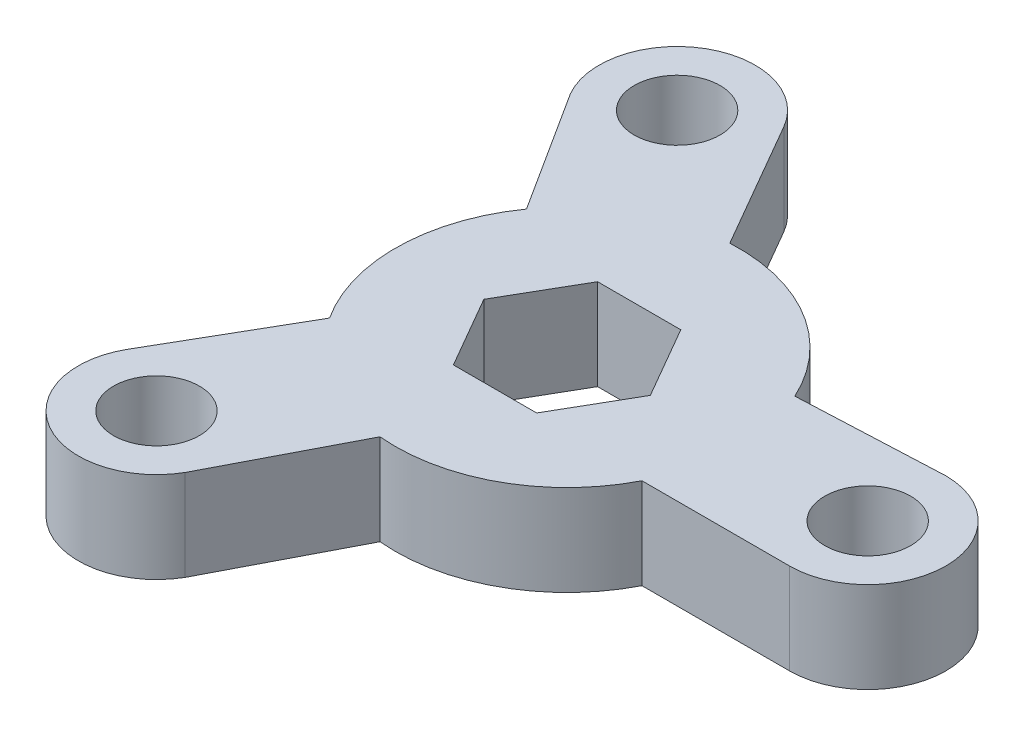
ISO-10303-21;
HEADER;
FILE_DESCRIPTION(('STEP AP214'),'2;1');
FILE_NAME('part.step','',(''),(''),'','','');
FILE_SCHEMA(('AUTOMOTIVE_DESIGN { 1 0 10303 214 1 1 1 1 }'));
ENDSEC;
DATA;
#1=APPLICATION_CONTEXT('core data for automotive mechanical design processes');
#2=APPLICATION_PROTOCOL_DEFINITION('international standard','automotive_design',2000,#1);
#3=PRODUCT_CONTEXT('',#1,'mechanical');
#4=PRODUCT('Part','Part','',(#3));
#5=PRODUCT_RELATED_PRODUCT_CATEGORY('part','',(#4));
#6=PRODUCT_DEFINITION_FORMATION('','',#4);
#7=PRODUCT_DEFINITION_CONTEXT('part definition',#1,'design');
#8=PRODUCT_DEFINITION('design','',#6,#7);
#9=PRODUCT_DEFINITION_SHAPE('','',#8);
#10=(LENGTH_UNIT() NAMED_UNIT(*) SI_UNIT(.MILLI.,.METRE.));
#11=(NAMED_UNIT(*) PLANE_ANGLE_UNIT() SI_UNIT($,.RADIAN.));
#12=(NAMED_UNIT(*) SI_UNIT($,.STERADIAN.) SOLID_ANGLE_UNIT());
#13=UNCERTAINTY_MEASURE_WITH_UNIT(LENGTH_MEASURE(1.E-05),#10,'distance_accuracy_value','');
#14=(GEOMETRIC_REPRESENTATION_CONTEXT(3) GLOBAL_UNCERTAINTY_ASSIGNED_CONTEXT((#13)) GLOBAL_UNIT_ASSIGNED_CONTEXT((#10,
#11,#12)) REPRESENTATION_CONTEXT('',''));
#15=CARTESIAN_POINT('',(0.,0.,0.));
#16=DIRECTION('',(0.,0.,1.));
#17=DIRECTION('',(1.,0.,0.));
#18=AXIS2_PLACEMENT_3D('',#15,#16,#17);
#19=CARTESIAN_POINT('',(0.000141202007934749,3.175,-9.02915575815009E-05));
#20=DIRECTION('',(0.842481897664744,0.,-0.538724653331562));
#21=DIRECTION('',(-0.538724653331562,0.,-0.842481897664744));
#22=AXIS2_PLACEMENT_3D('',#19,#20,#21);
#23=PLANE('',#22);
#24=DIRECTION('',(0.538724653331562,0.,0.842481897664744));
#25=VECTOR('',#24,1.);
#26=CARTESIAN_POINT('',(0.000141202007934749,0.,-9.02915575815009E-05));
#27=LINE('',#26,#25);
#28=CARTESIAN_POINT('',(-5.09848661235615,0.,-7.973554305071));
#29=VERTEX_POINT('',#28);
#30=CARTESIAN_POINT('',(-2.37747949642457,0.,-3.71832071883577));
#31=VERTEX_POINT('',#30);
#32=EDGE_CURVE('E195',#29,#31,#27,.T.);
#33=ORIENTED_EDGE('',*,*,#32,.T.);
#34=DIRECTION('',(0.,-1.,0.));
#35=VECTOR('',#34,1.);
#36=CARTESIAN_POINT('',(-2.37747949642457,3.175,-3.71832071883577));
#37=LINE('',#36,#35);
#38=CARTESIAN_POINT('',(-2.37747949642457,3.175,-3.71832071883577));
#39=VERTEX_POINT('',#38);
#40=EDGE_CURVE('E305',#39,#31,#37,.T.);
#41=ORIENTED_EDGE('',*,*,#40,.F.);
#42=DIRECTION('',(0.538724653331562,0.,0.842481897664744));
#43=VECTOR('',#42,1.);
#44=CARTESIAN_POINT('',(0.000141202007934749,3.175,-9.02915575815009E-05));
#45=LINE('',#44,#43);
#46=CARTESIAN_POINT('',(-5.09848661235615,3.175,-7.973554305071));
#47=VERTEX_POINT('',#46);
#48=EDGE_CURVE('E202',#47,#39,#45,.T.);
#49=ORIENTED_EDGE('',*,*,#48,.F.);
#50=DIRECTION('',(0.,-1.,0.));
#51=VECTOR('',#50,1.);
#52=CARTESIAN_POINT('',(-5.09848661235615,3.175,-7.973554305071));
#53=LINE('',#52,#51);
#54=EDGE_CURVE('E240',#47,#29,#53,.T.);
#55=ORIENTED_EDGE('',*,*,#54,.T.);
#56=EDGE_LOOP('',(#33,#41,#49,#55));
#57=FACE_BOUND('',#56,.T.);
#58=ADVANCED_FACE('F38',(#57),#23,.F.);
#59=CARTESIAN_POINT('',(2.51476204169552,3.175,-0.24470981191342));
#60=DIRECTION('',(0.,-1.,0.));
#61=DIRECTION('',(0.,0.,-1.));
#62=AXIS2_PLACEMENT_3D('',#59,#60,#61);
#63=CYLINDRICAL_SURFACE('',#62,6.00000000000002);
#64=CARTESIAN_POINT('',(2.51476204169552,0.,-0.24470981191342));
#65=DIRECTION('',(0.,1.,0.));
#66=DIRECTION('',(0.,0.,1.));
#67=AXIS2_PLACEMENT_3D('',#64,#65,#66);
#68=CIRCLE('',#67,6.00000000000002);
#69=CARTESIAN_POINT('',(-2.52025605095693,0.,3.01850835527385));
#70=VERTEX_POINT('',#69);
#71=EDGE_CURVE('E243',#31,#70,#68,.T.);
#72=ORIENTED_EDGE('',*,*,#71,.T.);
#73=DIRECTION('',(0.,-1.,0.));
#74=VECTOR('',#73,1.);
#75=CARTESIAN_POINT('',(-2.52025605095693,3.175,3.01850835527385));
#76=LINE('',#75,#74);
#77=CARTESIAN_POINT('',(-2.52025605095693,3.175,3.01850835527385));
#78=VERTEX_POINT('',#77);
#79=EDGE_CURVE('E303',#78,#70,#76,.T.);
#80=ORIENTED_EDGE('',*,*,#79,.F.);
#81=CARTESIAN_POINT('',(2.51476204169552,3.175,-0.24470981191342));
#82=DIRECTION('',(0.,1.,0.));
#83=DIRECTION('',(0.,0.,1.));
#84=AXIS2_PLACEMENT_3D('',#81,#82,#83);
#85=CIRCLE('',#84,6.00000000000002);
#86=EDGE_CURVE('E205',#39,#78,#85,.T.);
#87=ORIENTED_EDGE('',*,*,#86,.F.);
#88=ORIENTED_EDGE('',*,*,#40,.T.);
#89=EDGE_LOOP('',(#72,#80,#87,#88));
#90=FACE_BOUND('',#89,.T.);
#91=ADVANCED_FACE('F343',(#90),#63,.T.);
#92=CARTESIAN_POINT('',(-0.583139579616312,3.175,-0.336675793266596));
#93=DIRECTION('',(-0.866025403784443,0.,-0.499999999999992));
#94=DIRECTION('',(-0.499999999999992,0.,0.866025403784443));
#95=AXIS2_PLACEMENT_3D('',#92,#93,#94);
#96=PLANE('',#95);
#97=DIRECTION('',(0.499999999999992,0.,-0.866025403784443));
#98=VECTOR('',#97,1.);
#99=CARTESIAN_POINT('',(-0.583139579616312,0.,-0.336675793266596));
#100=LINE('',#99,#98);
#101=CARTESIAN_POINT('',(-5.09848661235621,0.,7.48413468124445));
#102=VERTEX_POINT('',#101);
#103=EDGE_CURVE('E246',#102,#70,#100,.T.);
#104=ORIENTED_EDGE('',*,*,#103,.F.);
#105=DIRECTION('',(0.,-1.,0.));
#106=VECTOR('',#105,1.);
#107=CARTESIAN_POINT('',(-5.09848661235621,3.175,7.48413468124445));
#108=LINE('',#107,#106);
#109=CARTESIAN_POINT('',(-5.09848661235621,3.175,7.48413468124445));
#110=VERTEX_POINT('',#109);
#111=EDGE_CURVE('E301',#110,#102,#108,.T.);
#112=ORIENTED_EDGE('',*,*,#111,.F.);
#113=DIRECTION('',(0.499999999999992,0.,-0.866025403784443));
#114=VECTOR('',#113,1.);
#115=CARTESIAN_POINT('',(-0.583139579616312,3.175,-0.336675793266596));
#116=LINE('',#115,#114);
#117=EDGE_CURVE('E208',#110,#78,#116,.T.);
#118=ORIENTED_EDGE('',*,*,#117,.T.);
#119=ORIENTED_EDGE('',*,*,#79,.T.);
#120=EDGE_LOOP('',(#104,#112,#118,#119));
#121=FACE_BOUND('',#120,.T.);
#122=ADVANCED_FACE('F348',(#121),#96,.T.);
#123=CARTESIAN_POINT('',(-2.73523795830433,3.175,8.84855692782332));
#124=DIRECTION('',(0.,-1.,0.));
#125=DIRECTION('',(0.,0.,-1.));
#126=AXIS2_PLACEMENT_3D('',#123,#124,#125);
#127=CYLINDRICAL_SURFACE('',#126,2.72884449315768);
#128=CARTESIAN_POINT('',(-2.73523795830433,0.,8.84855692782332));
#129=DIRECTION('',(0.,1.,0.));
#130=DIRECTION('',(0.,0.,1.));
#131=AXIS2_PLACEMENT_3D('',#128,#129,#130);
#132=CIRCLE('',#131,2.72884449315768);
#133=CARTESIAN_POINT('',(-0.371989304252619,0.,10.2129791744022));
#134=VERTEX_POINT('',#133);
#135=EDGE_CURVE('E249',#102,#134,#132,.T.);
#136=ORIENTED_EDGE('',*,*,#135,.T.);
#137=DIRECTION('',(0.,-1.,0.));
#138=VECTOR('',#137,1.);
#139=CARTESIAN_POINT('',(-0.371989304252619,3.175,10.2129791744022));
#140=LINE('',#139,#138);
#141=CARTESIAN_POINT('',(-0.371989304252619,3.175,10.2129791744022));
#142=VERTEX_POINT('',#141);
#143=EDGE_CURVE('E298',#142,#134,#140,.T.);
#144=ORIENTED_EDGE('',*,*,#143,.F.);
#145=CARTESIAN_POINT('',(-2.73523795830433,3.175,8.84855692782332));
#146=DIRECTION('',(0.,1.,0.));
#147=DIRECTION('',(0.,0.,1.));
#148=AXIS2_PLACEMENT_3D('',#145,#146,#147);
#149=CIRCLE('',#148,2.72884449315768);
#150=EDGE_CURVE('E211',#110,#142,#149,.T.);
#151=ORIENTED_EDGE('',*,*,#150,.F.);
#152=ORIENTED_EDGE('',*,*,#111,.T.);
#153=EDGE_LOOP('',(#136,#144,#151,#152));
#154=FACE_BOUND('',#153,.T.);
#155=ADVANCED_FACE('F400',(#154),#127,.T.);
#156=CARTESIAN_POINT('',(3.87987291900624,3.175,2.01140464348378));
#157=DIRECTION('',(-0.887790184262472,0.,-0.460248398940405));
#158=DIRECTION('',(-0.460248398940405,0.,0.887790184262472));
#159=AXIS2_PLACEMENT_3D('',#156,#157,#158);
#160=PLANE('',#159);
#161=DIRECTION('',(0.460248398940405,0.,-0.887790184262472));
#162=VECTOR('',#161,1.);
#163=CARTESIAN_POINT('',(3.87987291900624,0.,2.01140464348378));
#164=LINE('',#163,#162);
#165=CARTESIAN_POINT('',(1.95264752249807,0.,5.72890109500941));
#166=VERTEX_POINT('',#165);
#167=EDGE_CURVE('E251',#134,#166,#164,.T.);
#168=ORIENTED_EDGE('',*,*,#167,.T.);
#169=DIRECTION('',(0.,-1.,0.));
#170=VECTOR('',#169,1.);
#171=CARTESIAN_POINT('',(1.95264752249807,3.175,5.72890109500941));
#172=LINE('',#171,#170);
#173=CARTESIAN_POINT('',(1.95264752249807,3.175,5.72890109500941));
#174=VERTEX_POINT('',#173);
#175=EDGE_CURVE('E295',#174,#166,#172,.T.);
#176=ORIENTED_EDGE('',*,*,#175,.F.);
#177=DIRECTION('',(0.460248398940405,0.,-0.887790184262472));
#178=VECTOR('',#177,1.);
#179=CARTESIAN_POINT('',(3.87987291900624,3.175,2.01140464348378));
#180=LINE('',#179,#178);
#181=EDGE_CURVE('E213',#142,#174,#180,.T.);
#182=ORIENTED_EDGE('',*,*,#181,.F.);
#183=ORIENTED_EDGE('',*,*,#143,.T.);
#184=EDGE_LOOP('',(#168,#176,#182,#183));
#185=FACE_BOUND('',#184,.T.);
#186=ADVANCED_FACE('F395',(#185),#160,.F.);
#187=CARTESIAN_POINT('',(2.51476204169552,3.175,-0.24470981191342));
#188=DIRECTION('',(0.,-1.,0.));
#189=DIRECTION('',(0.,0.,-1.));
#190=AXIS2_PLACEMENT_3D('',#187,#188,#189);
#191=CYLINDRICAL_SURFACE('',#190,6.00000000000002);
#192=CARTESIAN_POINT('',(2.51476204169552,0.,-0.24470981191342));
#193=DIRECTION('',(0.,1.,0.));
#194=DIRECTION('',(0.,0.,1.));
#195=AXIS2_PLACEMENT_3D('',#192,#193,#194);
#196=CIRCLE('',#195,6.00000000000002);
#197=CARTESIAN_POINT('',(7.85830091889671,0.,2.48413468124468));
#198=VERTEX_POINT('',#197);
#199=EDGE_CURVE('E253',#166,#198,#196,.T.);
#200=ORIENTED_EDGE('',*,*,#199,.T.);
#201=DIRECTION('',(0.,-1.,0.));
#202=VECTOR('',#201,1.);
#203=CARTESIAN_POINT('',(7.85830091889671,3.175,2.48413468124468));
#204=LINE('',#203,#202);
#205=CARTESIAN_POINT('',(7.85830091889671,3.175,2.48413468124468));
#206=VERTEX_POINT('',#205);
#207=EDGE_CURVE('E293',#206,#198,#204,.T.);
#208=ORIENTED_EDGE('',*,*,#207,.F.);
#209=CARTESIAN_POINT('',(2.51476204169552,3.175,-0.24470981191342));
#210=DIRECTION('',(0.,1.,0.));
#211=DIRECTION('',(0.,0.,1.));
#212=AXIS2_PLACEMENT_3D('',#209,#210,#211);
#213=CIRCLE('',#212,6.00000000000002);
#214=EDGE_CURVE('E215',#174,#206,#213,.T.);
#215=ORIENTED_EDGE('',*,*,#214,.F.);
#216=ORIENTED_EDGE('',*,*,#175,.T.);
#217=EDGE_LOOP('',(#200,#208,#215,#216));
#218=FACE_BOUND('',#217,.T.);
#219=ADVANCED_FACE('F391',(#218),#191,.T.);
#220=CARTESIAN_POINT('',(0.,3.175,2.48413468124466));
#221=DIRECTION('',(0.,0.,1.));
#222=DIRECTION('',(1.,0.,0.));
#223=AXIS2_PLACEMENT_3D('',#220,#221,#222);
#224=PLANE('',#223);
#225=DIRECTION('',(-1.,0.,0.));
#226=VECTOR('',#225,1.);
#227=CARTESIAN_POINT('',(0.,0.,2.48413468124466));
#228=LINE('',#227,#226);
#229=CARTESIAN_POINT('',(13.0147620416956,0.,2.48413468124467));
#230=VERTEX_POINT('',#229);
#231=EDGE_CURVE('E256',#230,#198,#228,.T.);
#232=ORIENTED_EDGE('',*,*,#231,.F.);
#233=DIRECTION('',(0.,-1.,0.));
#234=VECTOR('',#233,1.);
#235=CARTESIAN_POINT('',(13.0147620416956,3.175,2.48413468124467));
#236=LINE('',#235,#234);
#237=CARTESIAN_POINT('',(13.0147620416956,3.175,2.48413468124467));
#238=VERTEX_POINT('',#237);
#239=EDGE_CURVE('E291',#238,#230,#236,.T.);
#240=ORIENTED_EDGE('',*,*,#239,.F.);
#241=DIRECTION('',(-1.,0.,0.));
#242=VECTOR('',#241,1.);
#243=CARTESIAN_POINT('',(0.,3.175,2.48413468124466));
#244=LINE('',#243,#242);
#245=EDGE_CURVE('E217',#238,#206,#244,.T.);
#246=ORIENTED_EDGE('',*,*,#245,.T.);
#247=ORIENTED_EDGE('',*,*,#207,.T.);
#248=EDGE_LOOP('',(#232,#240,#246,#247));
#249=FACE_BOUND('',#248,.T.);
#250=ADVANCED_FACE('F387',(#249),#224,.T.);
#251=CARTESIAN_POINT('',(13.0147620416956,3.175,-0.244709811913082));
#252=DIRECTION('',(0.,-1.,0.));
#253=DIRECTION('',(0.,0.,-1.));
#254=AXIS2_PLACEMENT_3D('',#251,#252,#253);
#255=CYLINDRICAL_SURFACE('',#254,2.72884449315774);
#256=CARTESIAN_POINT('',(13.0147620416956,0.,-0.244709811913082));
#257=DIRECTION('',(0.,1.,0.));
#258=DIRECTION('',(0.,0.,1.));
#259=AXIS2_PLACEMENT_3D('',#256,#257,#258);
#260=CIRCLE('',#259,2.72884449315774);
#261=CARTESIAN_POINT('',(13.0147620416957,0.,-2.97355430507082));
#262=VERTEX_POINT('',#261);
#263=EDGE_CURVE('E259',#230,#262,#260,.T.);
#264=ORIENTED_EDGE('',*,*,#263,.T.);
#265=DIRECTION('',(0.,-1.,0.));
#266=VECTOR('',#265,1.);
#267=CARTESIAN_POINT('',(13.0147620416957,3.175,-2.97355430507082));
#268=LINE('',#267,#266);
#269=CARTESIAN_POINT('',(13.0147620416957,3.175,-2.97355430507082));
#270=VERTEX_POINT('',#269);
#271=EDGE_CURVE('E288',#270,#262,#268,.T.);
#272=ORIENTED_EDGE('',*,*,#271,.F.);
#273=CARTESIAN_POINT('',(13.0147620416956,3.175,-0.244709811913082));
#274=DIRECTION('',(0.,1.,0.));
#275=DIRECTION('',(0.,0.,1.));
#276=AXIS2_PLACEMENT_3D('',#273,#274,#275);
#277=CIRCLE('',#276,2.72884449315774);
#278=EDGE_CURVE('E220',#238,#270,#277,.T.);
#279=ORIENTED_EDGE('',*,*,#278,.F.);
#280=ORIENTED_EDGE('',*,*,#239,.T.);
#281=EDGE_LOOP('',(#264,#272,#279,#280));
#282=FACE_BOUND('',#281,.T.);
#283=ADVANCED_FACE('F382',(#282),#255,.T.);
#284=CARTESIAN_POINT('',(-0.107871058470747,3.175,-2.37837906979619));
#285=DIRECTION('',(0.0453082865977139,0.,0.998973052271972));
#286=DIRECTION('',(0.998973052271972,0.,-0.0453082865977139));
#287=AXIS2_PLACEMENT_3D('',#284,#285,#286);
#288=PLANE('',#287);
#289=DIRECTION('',(-0.998973052271972,0.,0.0453082865977139));
#290=VECTOR('',#289,1.);
#291=CARTESIAN_POINT('',(-0.107871058470747,0.,-2.37837906979619));
#292=LINE('',#291,#290);
#293=CARTESIAN_POINT('',(7.9691180990133,0.,-2.74470981191346));
#294=VERTEX_POINT('',#293);
#295=EDGE_CURVE('E261',#262,#294,#292,.T.);
#296=ORIENTED_EDGE('',*,*,#295,.T.);
#297=DIRECTION('',(0.,-1.,0.));
#298=VECTOR('',#297,1.);
#299=CARTESIAN_POINT('',(7.9691180990133,3.175,-2.74470981191346));
#300=LINE('',#299,#298);
#301=CARTESIAN_POINT('',(7.9691180990133,3.175,-2.74470981191346));
#302=VERTEX_POINT('',#301);
#303=EDGE_CURVE('E285',#302,#294,#300,.T.);
#304=ORIENTED_EDGE('',*,*,#303,.F.);
#305=DIRECTION('',(-0.998973052271972,0.,0.0453082865977139));
#306=VECTOR('',#305,1.);
#307=CARTESIAN_POINT('',(-0.107871058470747,3.175,-2.37837906979619));
#308=LINE('',#307,#306);
#309=EDGE_CURVE('E222',#270,#302,#308,.T.);
#310=ORIENTED_EDGE('',*,*,#309,.F.);
#311=ORIENTED_EDGE('',*,*,#271,.T.);
#312=EDGE_LOOP('',(#296,#304,#310,#311));
#313=FACE_BOUND('',#312,.T.);
#314=ADVANCED_FACE('F378',(#313),#288,.F.);
#315=CARTESIAN_POINT('',(2.51476204169552,3.175,-0.24470981191342));
#316=DIRECTION('',(0.,-1.,0.));
#317=DIRECTION('',(0.,0.,-1.));
#318=AXIS2_PLACEMENT_3D('',#315,#316,#317);
#319=CYLINDRICAL_SURFACE('',#318,6.00000000000002);
#320=CARTESIAN_POINT('',(2.51476204169552,0.,-0.24470981191342));
#321=DIRECTION('',(0.,1.,0.));
#322=DIRECTION('',(0.,0.,1.));
#323=AXIS2_PLACEMENT_3D('',#320,#321,#322);
#324=CIRCLE('',#323,6.00000000000002);
#325=CARTESIAN_POINT('',(2.20624125714704,0.,-6.23677247225827));
#326=VERTEX_POINT('',#325);
#327=EDGE_CURVE('E263',#294,#326,#324,.T.);
#328=ORIENTED_EDGE('',*,*,#327,.T.);
#329=DIRECTION('',(0.,-1.,0.));
#330=VECTOR('',#329,1.);
#331=CARTESIAN_POINT('',(2.20624125714704,3.175,-6.23677247225827));
#332=LINE('',#331,#330);
#333=CARTESIAN_POINT('',(2.20624125714704,3.175,-6.23677247225827));
#334=VERTEX_POINT('',#333);
#335=EDGE_CURVE('E283',#334,#326,#332,.T.);
#336=ORIENTED_EDGE('',*,*,#335,.F.);
#337=CARTESIAN_POINT('',(2.51476204169552,3.175,-0.24470981191342));
#338=DIRECTION('',(0.,1.,0.));
#339=DIRECTION('',(0.,0.,1.));
#340=AXIS2_PLACEMENT_3D('',#337,#338,#339);
#341=CIRCLE('',#340,6.00000000000002);
#342=EDGE_CURVE('E224',#302,#334,#341,.T.);
#343=ORIENTED_EDGE('',*,*,#342,.F.);
#344=ORIENTED_EDGE('',*,*,#303,.T.);
#345=EDGE_LOOP('',(#328,#336,#343,#344));
#346=FACE_BOUND('',#345,.T.);
#347=ADVANCED_FACE('F373',(#346),#319,.T.);
#348=CARTESIAN_POINT('',(4.35528264215976,3.175,-2.51452360584784));
#349=DIRECTION('',(0.866025403784439,0.,-0.5));
#350=DIRECTION('',(-0.5,0.,-0.866025403784439));
#351=AXIS2_PLACEMENT_3D('',#348,#349,#350);
#352=PLANE('',#351);
#353=DIRECTION('',(0.5,0.,0.866025403784439));
#354=VECTOR('',#353,1.);
#355=CARTESIAN_POINT('',(4.35528264215976,0.,-2.51452360584784));
#356=LINE('',#355,#354);
#357=CARTESIAN_POINT('',(-0.371989304252358,0.,-10.7023987982286));
#358=VERTEX_POINT('',#357);
#359=EDGE_CURVE('E266',#358,#326,#356,.T.);
#360=ORIENTED_EDGE('',*,*,#359,.F.);
#361=DIRECTION('',(0.,-1.,0.));
#362=VECTOR('',#361,1.);
#363=CARTESIAN_POINT('',(-0.371989304252358,3.175,-10.7023987982286));
#364=LINE('',#363,#362);
#365=CARTESIAN_POINT('',(-0.371989304252358,3.175,-10.7023987982286));
#366=VERTEX_POINT('',#365);
#367=EDGE_CURVE('E281',#366,#358,#364,.T.);
#368=ORIENTED_EDGE('',*,*,#367,.F.);
#369=DIRECTION('',(0.5,0.,0.866025403784439));
#370=VECTOR('',#369,1.);
#371=CARTESIAN_POINT('',(4.35528264215976,3.175,-2.51452360584784));
#372=LINE('',#371,#370);
#373=EDGE_CURVE('E226',#366,#334,#372,.T.);
#374=ORIENTED_EDGE('',*,*,#373,.T.);
#375=ORIENTED_EDGE('',*,*,#335,.T.);
#376=EDGE_LOOP('',(#360,#368,#374,#375));
#377=FACE_BOUND('',#376,.T.);
#378=ADVANCED_FACE('F367',(#377),#352,.T.);
#379=CARTESIAN_POINT('',(-2.73523795830456,3.175,8.84855692782314));
#380=DIRECTION('',(0.,-1.,0.));
#381=DIRECTION('',(0.,0.,-1.));
#382=AXIS2_PLACEMENT_3D('',#379,#380,#381);
#383=CYLINDRICAL_SURFACE('',#382,1.50000000000004);
#384=CARTESIAN_POINT('',(-2.73523795830456,3.175,8.84855692782314));
#385=DIRECTION('',(0.,1.,0.));
#386=DIRECTION('',(0.,0.,1.));
#387=AXIS2_PLACEMENT_3D('',#384,#385,#386);
#388=CIRCLE('',#387,1.50000000000004);
#389=CARTESIAN_POINT('',(-2.73523795830456,3.175,10.3485569278232));
#390=VERTEX_POINT('',#389);
#391=EDGE_CURVE('E234',#390,#390,#388,.T.);
#392=ORIENTED_EDGE('',*,*,#391,.T.);
#393=EDGE_LOOP('',(#392));
#394=FACE_BOUND('',#393,.T.);
#395=CARTESIAN_POINT('',(-2.73523795830456,0.,8.84855692782314));
#396=DIRECTION('',(0.,1.,0.));
#397=DIRECTION('',(0.,0.,1.));
#398=AXIS2_PLACEMENT_3D('',#395,#396,#397);
#399=CIRCLE('',#398,1.50000000000004);
#400=CARTESIAN_POINT('',(-2.73523795830456,0.,10.3485569278232));
#401=VERTEX_POINT('',#400);
#402=EDGE_CURVE('E274',#401,#401,#399,.T.);
#403=ORIENTED_EDGE('',*,*,#402,.F.);
#404=EDGE_LOOP('',(#403));
#405=FACE_BOUND('',#404,.T.);
#406=ADVANCED_FACE('F423',(#394,#405),#383,.F.);
#407=CARTESIAN_POINT('',(13.0147620416955,3.175,-0.244709811913334));
#408=DIRECTION('',(0.,-1.,0.));
#409=DIRECTION('',(0.,0.,-1.));
#410=AXIS2_PLACEMENT_3D('',#407,#408,#409);
#411=CYLINDRICAL_SURFACE('',#410,1.50000000000004);
#412=CARTESIAN_POINT('',(13.0147620416955,3.175,-0.244709811913334));
#413=DIRECTION('',(0.,1.,0.));
#414=DIRECTION('',(0.,0.,1.));
#415=AXIS2_PLACEMENT_3D('',#412,#413,#414);
#416=CIRCLE('',#415,1.50000000000004);
#417=CARTESIAN_POINT('',(13.0147620416955,3.175,1.2552901880867));
#418=VERTEX_POINT('',#417);
#419=EDGE_CURVE('E231',#418,#418,#416,.T.);
#420=ORIENTED_EDGE('',*,*,#419,.T.);
#421=EDGE_LOOP('',(#420));
#422=FACE_BOUND('',#421,.T.);
#423=CARTESIAN_POINT('',(13.0147620416955,0.,-0.244709811913334));
#424=DIRECTION('',(0.,1.,0.));
#425=DIRECTION('',(0.,0.,1.));
#426=AXIS2_PLACEMENT_3D('',#423,#424,#425);
#427=CIRCLE('',#426,1.50000000000004);
#428=CARTESIAN_POINT('',(13.0147620416955,0.,1.2552901880867));
#429=VERTEX_POINT('',#428);
#430=EDGE_CURVE('E271',#429,#429,#427,.T.);
#431=ORIENTED_EDGE('',*,*,#430,.F.);
#432=EDGE_LOOP('',(#431));
#433=FACE_BOUND('',#432,.T.);
#434=ADVANCED_FACE('F427',(#422,#433),#411,.F.);
#435=CARTESIAN_POINT('',(-2.73523795830425,3.175,-9.33797655164976));
#436=DIRECTION('',(0.,-1.,0.));
#437=DIRECTION('',(0.,0.,-1.));
#438=AXIS2_PLACEMENT_3D('',#435,#436,#437);
#439=CYLINDRICAL_SURFACE('',#438,2.72884449315774);
#440=CARTESIAN_POINT('',(-2.73523795830425,0.,-9.33797655164976));
#441=DIRECTION('',(0.,1.,0.));
#442=DIRECTION('',(0.,0.,1.));
#443=AXIS2_PLACEMENT_3D('',#440,#441,#442);
#444=CIRCLE('',#443,2.72884449315774);
#445=EDGE_CURVE('E269',#358,#29,#444,.T.);
#446=ORIENTED_EDGE('',*,*,#445,.T.);
#447=ORIENTED_EDGE('',*,*,#54,.F.);
#448=CARTESIAN_POINT('',(-2.73523795830425,3.175,-9.33797655164976));
#449=DIRECTION('',(0.,1.,0.));
#450=DIRECTION('',(0.,0.,1.));
#451=AXIS2_PLACEMENT_3D('',#448,#449,#450);
#452=CIRCLE('',#451,2.72884449315774);
#453=EDGE_CURVE('E229',#366,#47,#452,.T.);
#454=ORIENTED_EDGE('',*,*,#453,.F.);
#455=ORIENTED_EDGE('',*,*,#367,.T.);
#456=EDGE_LOOP('',(#446,#447,#454,#455));
#457=FACE_BOUND('',#456,.T.);
#458=ADVANCED_FACE('F365',(#457),#439,.T.);
#459=CARTESIAN_POINT('',(-2.73523795830425,3.175,-9.33797655164976));
#460=DIRECTION('',(0.,-1.,0.));
#461=DIRECTION('',(0.,0.,-1.));
#462=AXIS2_PLACEMENT_3D('',#459,#460,#461);
#463=CYLINDRICAL_SURFACE('',#462,1.49999999999987);
#464=CARTESIAN_POINT('',(-2.73523795830425,3.175,-9.33797655164976));
#465=DIRECTION('',(0.,1.,0.));
#466=DIRECTION('',(0.,0.,1.));
#467=AXIS2_PLACEMENT_3D('',#464,#465,#466);
#468=CIRCLE('',#467,1.49999999999987);
#469=CARTESIAN_POINT('',(-2.73523795830425,3.175,-7.83797655164989));
#470=VERTEX_POINT('',#469);
#471=EDGE_CURVE('E237',#470,#470,#468,.T.);
#472=ORIENTED_EDGE('',*,*,#471,.T.);
#473=EDGE_LOOP('',(#472));
#474=FACE_BOUND('',#473,.T.);
#475=CARTESIAN_POINT('',(-2.73523795830425,0.,-9.33797655164976));
#476=DIRECTION('',(0.,1.,0.));
#477=DIRECTION('',(0.,0.,1.));
#478=AXIS2_PLACEMENT_3D('',#475,#476,#477);
#479=CIRCLE('',#478,1.49999999999987);
#480=CARTESIAN_POINT('',(-2.73523795830425,0.,-7.83797655164989));
#481=VERTEX_POINT('',#480);
#482=EDGE_CURVE('E206',#481,#481,#479,.T.);
#483=ORIENTED_EDGE('',*,*,#482,.F.);
#484=EDGE_LOOP('',(#483));
#485=FACE_BOUND('',#484,.T.);
#486=ADVANCED_FACE('F426',(#474,#485),#463,.F.);
#487=CARTESIAN_POINT('',(0.,3.175,0.));
#488=DIRECTION('',(0.,1.,0.));
#489=DIRECTION('',(0.,0.,1.));
#490=AXIS2_PLACEMENT_3D('',#487,#488,#489);
#491=PLANE('',#490);
#492=DIRECTION('',(0.5,0.,-0.866025403784438));
#493=VECTOR('',#492,1.);
#494=CARTESIAN_POINT('',(3.96824134438037,3.175,2.27279018808658));
#495=LINE('',#494,#493);
#496=CARTESIAN_POINT('',(3.96824134438037,3.175,2.27279018808658));
#497=VERTEX_POINT('',#496);
#498=CARTESIAN_POINT('',(5.42172064706526,3.175,-0.244709811913421));
#499=VERTEX_POINT('',#498);
#500=EDGE_CURVE('E52',#497,#499,#495,.T.);
#501=ORIENTED_EDGE('',*,*,#500,.F.);
#502=DIRECTION('',(1.,0.,0.));
#503=VECTOR('',#502,1.);
#504=CARTESIAN_POINT('',(1.06128273901061,3.175,2.27279018808658));
#505=LINE('',#504,#503);
#506=CARTESIAN_POINT('',(1.06128273901061,3.175,2.27279018808658));
#507=VERTEX_POINT('',#506);
#508=EDGE_CURVE('E190',#507,#497,#505,.T.);
#509=ORIENTED_EDGE('',*,*,#508,.F.);
#510=DIRECTION('',(0.5,0.,0.866025403784439));
#511=VECTOR('',#510,1.);
#512=CARTESIAN_POINT('',(-0.392196563674275,3.175,-0.24470981191342));
#513=LINE('',#512,#511);
#514=CARTESIAN_POINT('',(-0.392196563674275,3.175,-0.24470981191342));
#515=VERTEX_POINT('',#514);
#516=EDGE_CURVE('E184',#515,#507,#513,.T.);
#517=ORIENTED_EDGE('',*,*,#516,.F.);
#518=DIRECTION('',(-0.5,0.,0.866025403784439));
#519=VECTOR('',#518,1.);
#520=CARTESIAN_POINT('',(1.06128273901061,3.175,-2.76220981191342));
#521=LINE('',#520,#519);
#522=CARTESIAN_POINT('',(1.06128273901061,3.175,-2.76220981191342));
#523=VERTEX_POINT('',#522);
#524=EDGE_CURVE('E182',#523,#515,#521,.T.);
#525=ORIENTED_EDGE('',*,*,#524,.F.);
#526=DIRECTION('',(-1.,0.,0.));
#527=VECTOR('',#526,1.);
#528=CARTESIAN_POINT('',(3.96824134438037,3.175,-2.76220981191342));
#529=LINE('',#528,#527);
#530=CARTESIAN_POINT('',(3.96824134438037,3.175,-2.76220981191342));
#531=VERTEX_POINT('',#530);
#532=EDGE_CURVE('E165',#531,#523,#529,.T.);
#533=ORIENTED_EDGE('',*,*,#532,.F.);
#534=DIRECTION('',(-0.5,0.,-0.866025403784439));
#535=VECTOR('',#534,1.);
#536=CARTESIAN_POINT('',(5.42172064706526,3.175,-0.244709811913421));
#537=LINE('',#536,#535);
#538=EDGE_CURVE('E174',#499,#531,#537,.T.);
#539=ORIENTED_EDGE('',*,*,#538,.F.);
#540=EDGE_LOOP('',(#501,#509,#517,#525,#533,#539));
#541=FACE_BOUND('',#540,.T.);
#542=ORIENTED_EDGE('',*,*,#48,.T.);
#543=ORIENTED_EDGE('',*,*,#86,.T.);
#544=ORIENTED_EDGE('',*,*,#117,.F.);
#545=ORIENTED_EDGE('',*,*,#150,.T.);
#546=ORIENTED_EDGE('',*,*,#181,.T.);
#547=ORIENTED_EDGE('',*,*,#214,.T.);
#548=ORIENTED_EDGE('',*,*,#245,.F.);
#549=ORIENTED_EDGE('',*,*,#278,.T.);
#550=ORIENTED_EDGE('',*,*,#309,.T.);
#551=ORIENTED_EDGE('',*,*,#342,.T.);
#552=ORIENTED_EDGE('',*,*,#373,.F.);
#553=ORIENTED_EDGE('',*,*,#453,.T.);
#554=EDGE_LOOP('',(#542,#543,#544,#545,#546,#547,#548,#549,#550,#551,#552,#553));
#555=FACE_BOUND('',#554,.T.);
#556=ORIENTED_EDGE('',*,*,#419,.F.);
#557=EDGE_LOOP('',(#556));
#558=FACE_BOUND('',#557,.T.);
#559=ORIENTED_EDGE('',*,*,#391,.F.);
#560=EDGE_LOOP('',(#559));
#561=FACE_BOUND('',#560,.T.);
#562=ORIENTED_EDGE('',*,*,#471,.F.);
#563=EDGE_LOOP('',(#562));
#564=FACE_BOUND('',#563,.T.);
#565=ADVANCED_FACE('F178',(#541,#555,#558,#561,#564),#491,.T.);
#566=CARTESIAN_POINT('',(0.,0.,0.));
#567=DIRECTION('',(0.,1.,0.));
#568=DIRECTION('',(0.,0.,1.));
#569=AXIS2_PLACEMENT_3D('',#566,#567,#568);
#570=PLANE('',#569);
#571=DIRECTION('',(1.,0.,0.));
#572=VECTOR('',#571,1.);
#573=CARTESIAN_POINT('',(0.,0.,2.27279018808658));
#574=LINE('',#573,#572);
#575=CARTESIAN_POINT('',(1.06128273901061,0.,2.27279018808658));
#576=VERTEX_POINT('',#575);
#577=CARTESIAN_POINT('',(3.96824134438037,0.,2.27279018808658));
#578=VERTEX_POINT('',#577);
#579=EDGE_CURVE('E45',#576,#578,#574,.T.);
#580=ORIENTED_EDGE('',*,*,#579,.T.);
#581=DIRECTION('',(0.5,0.,-0.866025403784439));
#582=VECTOR('',#581,1.);
#583=CARTESIAN_POINT('',(3.96032802846278,0.,2.2864964533122));
#584=LINE('',#583,#582);
#585=CARTESIAN_POINT('',(5.42172064706526,0.,-0.244709811913421));
#586=VERTEX_POINT('',#585);
#587=EDGE_CURVE('E11',#578,#586,#584,.T.);
#588=ORIENTED_EDGE('',*,*,#587,.T.);
#589=DIRECTION('',(-0.5,0.,-0.866025403784439));
#590=VECTOR('',#589,1.);
#591=CARTESIAN_POINT('',(4.17225294213511,0.,-2.40885135926891));
#592=LINE('',#591,#590);
#593=CARTESIAN_POINT('',(3.96824134438037,0.,-2.76220981191342));
#594=VERTEX_POINT('',#593);
#595=EDGE_CURVE('E308',#586,#594,#592,.T.);
#596=ORIENTED_EDGE('',*,*,#595,.T.);
#597=DIRECTION('',(-1.,0.,0.));
#598=VECTOR('',#597,1.);
#599=CARTESIAN_POINT('',(0.,0.,-2.76220981191342));
#600=LINE('',#599,#598);
#601=CARTESIAN_POINT('',(1.06128273901061,0.,-2.76220981191342));
#602=VERTEX_POINT('',#601);
#603=EDGE_CURVE('E168',#594,#602,#600,.T.);
#604=ORIENTED_EDGE('',*,*,#603,.T.);
#605=DIRECTION('',(-0.5,0.,0.866025403784439));
#606=VECTOR('',#605,1.);
#607=CARTESIAN_POINT('',(-0.400109879591874,0.,-0.231003546687797));
#608=LINE('',#607,#606);
#609=CARTESIAN_POINT('',(-0.392196563674275,0.,-0.24470981191342));
#610=VERTEX_POINT('',#609);
#611=EDGE_CURVE('E311',#602,#610,#608,.T.);
#612=ORIENTED_EDGE('',*,*,#611,.T.);
#613=DIRECTION('',(0.5,0.,0.866025403784439));
#614=VECTOR('',#613,1.);
#615=CARTESIAN_POINT('',(-0.18818496591954,0.,0.108648640731087));
#616=LINE('',#615,#614);
#617=EDGE_CURVE('E314',#610,#576,#616,.T.);
#618=ORIENTED_EDGE('',*,*,#617,.T.);
#619=EDGE_LOOP('',(#580,#588,#596,#604,#612,#618));
#620=FACE_BOUND('',#619,.T.);
#621=ORIENTED_EDGE('',*,*,#32,.F.);
#622=ORIENTED_EDGE('',*,*,#445,.F.);
#623=ORIENTED_EDGE('',*,*,#359,.T.);
#624=ORIENTED_EDGE('',*,*,#327,.F.);
#625=ORIENTED_EDGE('',*,*,#295,.F.);
#626=ORIENTED_EDGE('',*,*,#263,.F.);
#627=ORIENTED_EDGE('',*,*,#231,.T.);
#628=ORIENTED_EDGE('',*,*,#199,.F.);
#629=ORIENTED_EDGE('',*,*,#167,.F.);
#630=ORIENTED_EDGE('',*,*,#135,.F.);
#631=ORIENTED_EDGE('',*,*,#103,.T.);
#632=ORIENTED_EDGE('',*,*,#71,.F.);
#633=EDGE_LOOP('',(#621,#622,#623,#624,#625,#626,#627,#628,#629,#630,#631,#632));
#634=FACE_BOUND('',#633,.T.);
#635=ORIENTED_EDGE('',*,*,#430,.T.);
#636=EDGE_LOOP('',(#635));
#637=FACE_BOUND('',#636,.T.);
#638=ORIENTED_EDGE('',*,*,#402,.T.);
#639=EDGE_LOOP('',(#638));
#640=FACE_BOUND('',#639,.T.);
#641=ORIENTED_EDGE('',*,*,#482,.T.);
#642=EDGE_LOOP('',(#641));
#643=FACE_BOUND('',#642,.T.);
#644=ADVANCED_FACE('F318',(#620,#634,#637,#640,#643),#570,.F.);
#645=CARTESIAN_POINT('',(3.96824134438037,-6.825,2.27279018808658));
#646=DIRECTION('',(0.866025403784439,0.,0.5));
#647=DIRECTION('',(0.5,0.,-0.866025403784439));
#648=AXIS2_PLACEMENT_3D('',#645,#646,#647);
#649=PLANE('',#648);
#650=DIRECTION('',(0.,1.,0.));
#651=VECTOR('',#650,1.);
#652=CARTESIAN_POINT('',(3.96824134438037,-6.825,2.27279018808658));
#653=LINE('',#652,#651);
#654=EDGE_CURVE('E193',#578,#497,#653,.T.);
#655=ORIENTED_EDGE('',*,*,#654,.T.);
#656=ORIENTED_EDGE('',*,*,#500,.T.);
#657=DIRECTION('',(0.,1.,0.));
#658=VECTOR('',#657,1.);
#659=CARTESIAN_POINT('',(5.42172064706526,-6.825,-0.244709811913421));
#660=LINE('',#659,#658);
#661=EDGE_CURVE('E171',#586,#499,#660,.T.);
#662=ORIENTED_EDGE('',*,*,#661,.F.);
#663=ORIENTED_EDGE('',*,*,#587,.F.);
#664=EDGE_LOOP('',(#655,#656,#662,#663));
#665=FACE_BOUND('',#664,.T.);
#666=ADVANCED_FACE('F330',(#665),#649,.F.);
#667=CARTESIAN_POINT('',(1.06128273901061,-6.825,2.27279018808658));
#668=DIRECTION('',(0.,0.,1.));
#669=DIRECTION('',(1.,0.,0.));
#670=AXIS2_PLACEMENT_3D('',#667,#668,#669);
#671=PLANE('',#670);
#672=DIRECTION('',(0.,1.,0.));
#673=VECTOR('',#672,1.);
#674=CARTESIAN_POINT('',(1.06128273901061,-6.825,2.27279018808658));
#675=LINE('',#674,#673);
#676=EDGE_CURVE('E196',#576,#507,#675,.T.);
#677=ORIENTED_EDGE('',*,*,#676,.T.);
#678=ORIENTED_EDGE('',*,*,#508,.T.);
#679=ORIENTED_EDGE('',*,*,#654,.F.);
#680=ORIENTED_EDGE('',*,*,#579,.F.);
#681=EDGE_LOOP('',(#677,#678,#679,#680));
#682=FACE_BOUND('',#681,.T.);
#683=ADVANCED_FACE('F323',(#682),#671,.F.);
#684=CARTESIAN_POINT('',(-0.392196563674275,-6.825,-0.24470981191342));
#685=DIRECTION('',(-0.866025403784439,0.,0.5));
#686=DIRECTION('',(0.5,0.,0.866025403784439));
#687=AXIS2_PLACEMENT_3D('',#684,#685,#686);
#688=PLANE('',#687);
#689=DIRECTION('',(0.,1.,0.));
#690=VECTOR('',#689,1.);
#691=CARTESIAN_POINT('',(-0.392196563674275,-6.825,-0.24470981191342));
#692=LINE('',#691,#690);
#693=EDGE_CURVE('E198',#610,#515,#692,.T.);
#694=ORIENTED_EDGE('',*,*,#693,.T.);
#695=ORIENTED_EDGE('',*,*,#516,.T.);
#696=ORIENTED_EDGE('',*,*,#676,.F.);
#697=ORIENTED_EDGE('',*,*,#617,.F.);
#698=EDGE_LOOP('',(#694,#695,#696,#697));
#699=FACE_BOUND('',#698,.T.);
#700=ADVANCED_FACE('F325',(#699),#688,.F.);
#701=CARTESIAN_POINT('',(1.06128273901061,-6.825,-2.76220981191342));
#702=DIRECTION('',(-0.866025403784438,0.,-0.5));
#703=DIRECTION('',(-0.5,0.,0.866025403784439));
#704=AXIS2_PLACEMENT_3D('',#701,#702,#703);
#705=PLANE('',#704);
#706=DIRECTION('',(0.,1.,0.));
#707=VECTOR('',#706,1.);
#708=CARTESIAN_POINT('',(1.06128273901061,-6.825,-2.76220981191342));
#709=LINE('',#708,#707);
#710=EDGE_CURVE('E170',#602,#523,#709,.T.);
#711=ORIENTED_EDGE('',*,*,#710,.T.);
#712=ORIENTED_EDGE('',*,*,#524,.T.);
#713=ORIENTED_EDGE('',*,*,#693,.F.);
#714=ORIENTED_EDGE('',*,*,#611,.F.);
#715=EDGE_LOOP('',(#711,#712,#713,#714));
#716=FACE_BOUND('',#715,.T.);
#717=ADVANCED_FACE('F329',(#716),#705,.F.);
#718=CARTESIAN_POINT('',(3.96824134438037,-6.825,-2.76220981191342));
#719=DIRECTION('',(0.,0.,-1.));
#720=DIRECTION('',(-1.,0.,0.));
#721=AXIS2_PLACEMENT_3D('',#718,#719,#720);
#722=PLANE('',#721);
#723=DIRECTION('',(0.,1.,0.));
#724=VECTOR('',#723,1.);
#725=CARTESIAN_POINT('',(3.96824134438037,-6.825,-2.76220981191342));
#726=LINE('',#725,#724);
#727=EDGE_CURVE('E60',#594,#531,#726,.T.);
#728=ORIENTED_EDGE('',*,*,#727,.T.);
#729=ORIENTED_EDGE('',*,*,#532,.T.);
#730=ORIENTED_EDGE('',*,*,#710,.F.);
#731=ORIENTED_EDGE('',*,*,#603,.F.);
#732=EDGE_LOOP('',(#728,#729,#730,#731));
#733=FACE_BOUND('',#732,.T.);
#734=ADVANCED_FACE('F162',(#733),#722,.F.);
#735=CARTESIAN_POINT('',(5.42172064706526,-6.825,-0.244709811913421));
#736=DIRECTION('',(0.866025403784439,0.,-0.5));
#737=DIRECTION('',(-0.5,0.,-0.866025403784439));
#738=AXIS2_PLACEMENT_3D('',#735,#736,#737);
#739=PLANE('',#738);
#740=ORIENTED_EDGE('',*,*,#661,.T.);
#741=ORIENTED_EDGE('',*,*,#538,.T.);
#742=ORIENTED_EDGE('',*,*,#727,.F.);
#743=ORIENTED_EDGE('',*,*,#595,.F.);
#744=EDGE_LOOP('',(#740,#741,#742,#743));
#745=FACE_BOUND('',#744,.T.);
#746=ADVANCED_FACE('F175',(#745),#739,.F.);
#747=CLOSED_SHELL('',(#58,#91,#122,#155,#186,#219,#250,#283,#314,#347,#378,#406,#434,#458,#486,
#565,#644,#666,#683,#700,#717,#734,#746));
#748=MANIFOLD_SOLID_BREP('B2',#747);
#749=ADVANCED_BREP_SHAPE_REPRESENTATION('',(#18,#748),#14);
#750=SHAPE_DEFINITION_REPRESENTATION(#9,#749);
ENDSEC;
END-ISO-10303-21;
